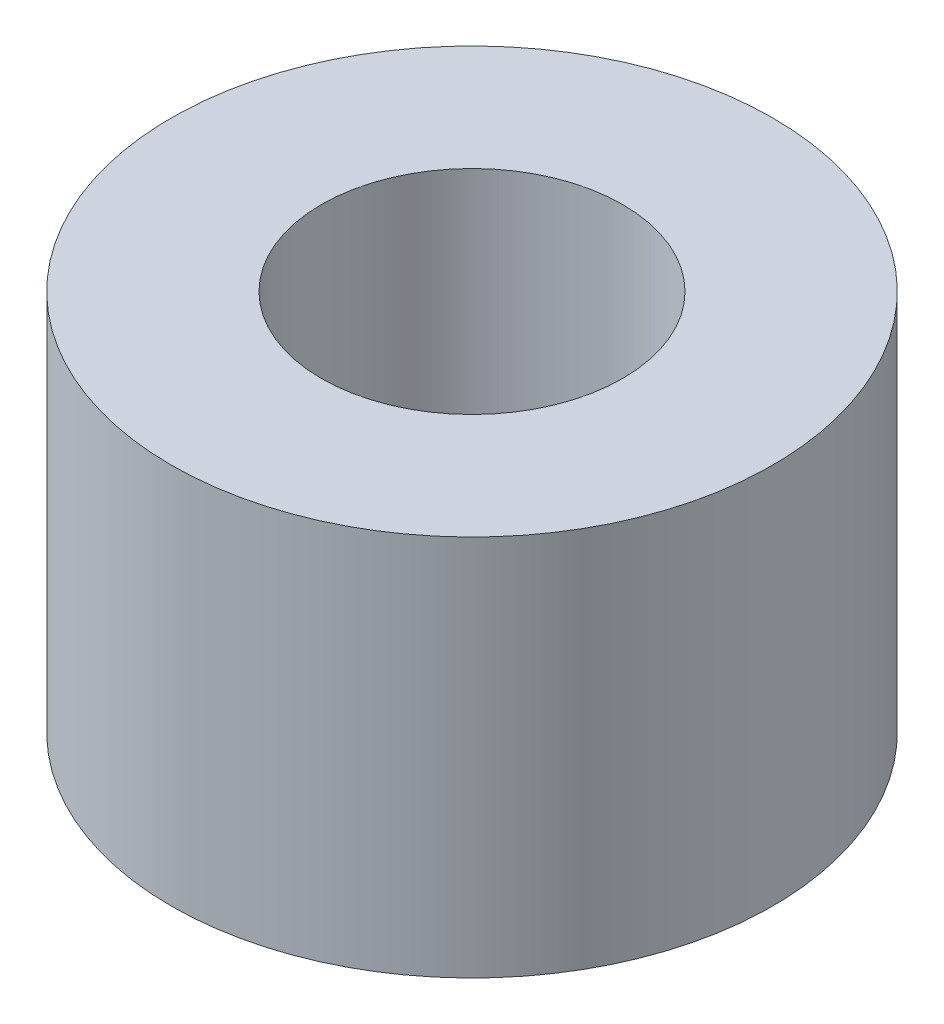
ISO-10303-21;
HEADER;
FILE_DESCRIPTION(('STEP AP214'),'2;1');
FILE_NAME('part.step','',(''),(''),'','','');
FILE_SCHEMA(('AUTOMOTIVE_DESIGN { 1 0 10303 214 1 1 1 1 }'));
ENDSEC;
DATA;
#1=APPLICATION_CONTEXT('core data for automotive mechanical design processes');
#2=APPLICATION_PROTOCOL_DEFINITION('international standard','automotive_design',2000,#1);
#3=PRODUCT_CONTEXT('',#1,'mechanical');
#4=PRODUCT('Part','Part','',(#3));
#5=PRODUCT_RELATED_PRODUCT_CATEGORY('part','',(#4));
#6=PRODUCT_DEFINITION_FORMATION('','',#4);
#7=PRODUCT_DEFINITION_CONTEXT('part definition',#1,'design');
#8=PRODUCT_DEFINITION('design','',#6,#7);
#9=PRODUCT_DEFINITION_SHAPE('','',#8);
#10=(LENGTH_UNIT() NAMED_UNIT(*) SI_UNIT(.MILLI.,.METRE.));
#11=(NAMED_UNIT(*) PLANE_ANGLE_UNIT() SI_UNIT($,.RADIAN.));
#12=(NAMED_UNIT(*) SI_UNIT($,.STERADIAN.) SOLID_ANGLE_UNIT());
#13=UNCERTAINTY_MEASURE_WITH_UNIT(LENGTH_MEASURE(1.E-05),#10,'distance_accuracy_value','');
#14=(GEOMETRIC_REPRESENTATION_CONTEXT(3) GLOBAL_UNCERTAINTY_ASSIGNED_CONTEXT((#13)) GLOBAL_UNIT_ASSIGNED_CONTEXT((#10,
#11,#12)) REPRESENTATION_CONTEXT('',''));
#15=CARTESIAN_POINT('',(0.,0.,0.));
#16=DIRECTION('',(0.,0.,1.));
#17=DIRECTION('',(1.,0.,0.));
#18=AXIS2_PLACEMENT_3D('',#15,#16,#17);
#19=CARTESIAN_POINT('',(0.,-0.001000000000001,0.));
#20=DIRECTION('',(0.,1.,0.));
#21=DIRECTION('',(0.,0.,1.));
#22=AXIS2_PLACEMENT_3D('',#19,#20,#21);
#23=CYLINDRICAL_SURFACE('',#22,6.3627);
#24=CARTESIAN_POINT('',(0.,16.129,0.));
#25=DIRECTION('',(0.,1.,0.));
#26=DIRECTION('',(0.,0.,1.));
#27=AXIS2_PLACEMENT_3D('',#24,#25,#26);
#28=CIRCLE('',#27,6.3627);
#29=CARTESIAN_POINT('',(0.,16.129,6.3627));
#30=VERTEX_POINT('',#29);
#31=EDGE_CURVE('E18',#30,#30,#28,.F.);
#32=ORIENTED_EDGE('',*,*,#31,.F.);
#33=EDGE_LOOP('',(#32));
#34=FACE_BOUND('',#33,.T.);
#35=CARTESIAN_POINT('',(0.,0.,0.));
#36=DIRECTION('',(0.,1.,0.));
#37=DIRECTION('',(0.,0.,1.));
#38=AXIS2_PLACEMENT_3D('',#35,#36,#37);
#39=CIRCLE('',#38,6.3627);
#40=CARTESIAN_POINT('',(0.,0.,6.3627));
#41=VERTEX_POINT('',#40);
#42=EDGE_CURVE('E27',#41,#41,#39,.F.);
#43=ORIENTED_EDGE('',*,*,#42,.T.);
#44=EDGE_LOOP('',(#43));
#45=FACE_BOUND('',#44,.T.);
#46=ADVANCED_FACE('F15',(#34,#45),#23,.F.);
#47=CARTESIAN_POINT('',(0.,16.129,0.));
#48=DIRECTION('',(0.,1.,0.));
#49=DIRECTION('',(0.,0.,1.));
#50=AXIS2_PLACEMENT_3D('',#47,#48,#49);
#51=PLANE('',#50);
#52=CARTESIAN_POINT('',(0.,16.129,0.));
#53=DIRECTION('',(0.,-1.,0.));
#54=DIRECTION('',(0.,0.,-1.));
#55=AXIS2_PLACEMENT_3D('',#52,#53,#54);
#56=CIRCLE('',#55,12.7);
#57=CARTESIAN_POINT('',(0.,16.129,-12.7));
#58=VERTEX_POINT('',#57);
#59=EDGE_CURVE('E22',#58,#58,#56,.T.);
#60=ORIENTED_EDGE('',*,*,#59,.F.);
#61=EDGE_LOOP('',(#60));
#62=FACE_BOUND('',#61,.T.);
#63=ORIENTED_EDGE('',*,*,#31,.T.);
#64=EDGE_LOOP('',(#63));
#65=FACE_BOUND('',#64,.T.);
#66=ADVANCED_FACE('F35',(#62,#65),#51,.T.);
#67=CARTESIAN_POINT('',(0.,0.,0.));
#68=DIRECTION('',(0.,1.,0.));
#69=DIRECTION('',(0.,0.,1.));
#70=AXIS2_PLACEMENT_3D('',#67,#68,#69);
#71=PLANE('',#70);
#72=CARTESIAN_POINT('',(0.,0.,0.));
#73=DIRECTION('',(0.,-1.,0.));
#74=DIRECTION('',(0.,0.,-1.));
#75=AXIS2_PLACEMENT_3D('',#72,#73,#74);
#76=CIRCLE('',#75,12.7);
#77=CARTESIAN_POINT('',(0.,0.,-12.7));
#78=VERTEX_POINT('',#77);
#79=EDGE_CURVE('E10',#78,#78,#76,.F.);
#80=ORIENTED_EDGE('',*,*,#79,.F.);
#81=EDGE_LOOP('',(#80));
#82=FACE_BOUND('',#81,.T.);
#83=ORIENTED_EDGE('',*,*,#42,.F.);
#84=EDGE_LOOP('',(#83));
#85=FACE_BOUND('',#84,.T.);
#86=ADVANCED_FACE('F42',(#82,#85),#71,.F.);
#87=CARTESIAN_POINT('',(0.,16.129,0.));
#88=DIRECTION('',(0.,-1.,0.));
#89=DIRECTION('',(0.,0.,-1.));
#90=AXIS2_PLACEMENT_3D('',#87,#88,#89);
#91=CYLINDRICAL_SURFACE('',#90,12.7);
#92=ORIENTED_EDGE('',*,*,#79,.T.);
#93=EDGE_LOOP('',(#92));
#94=FACE_BOUND('',#93,.T.);
#95=ORIENTED_EDGE('',*,*,#59,.T.);
#96=EDGE_LOOP('',(#95));
#97=FACE_BOUND('',#96,.T.);
#98=ADVANCED_FACE('F44',(#94,#97),#91,.T.);
#99=CLOSED_SHELL('',(#46,#66,#86,#98));
#100=MANIFOLD_SOLID_BREP('B1',#99);
#101=ADVANCED_BREP_SHAPE_REPRESENTATION('',(#18,#100),#14);
#102=SHAPE_DEFINITION_REPRESENTATION(#9,#101);
ENDSEC;
END-ISO-10303-21;
